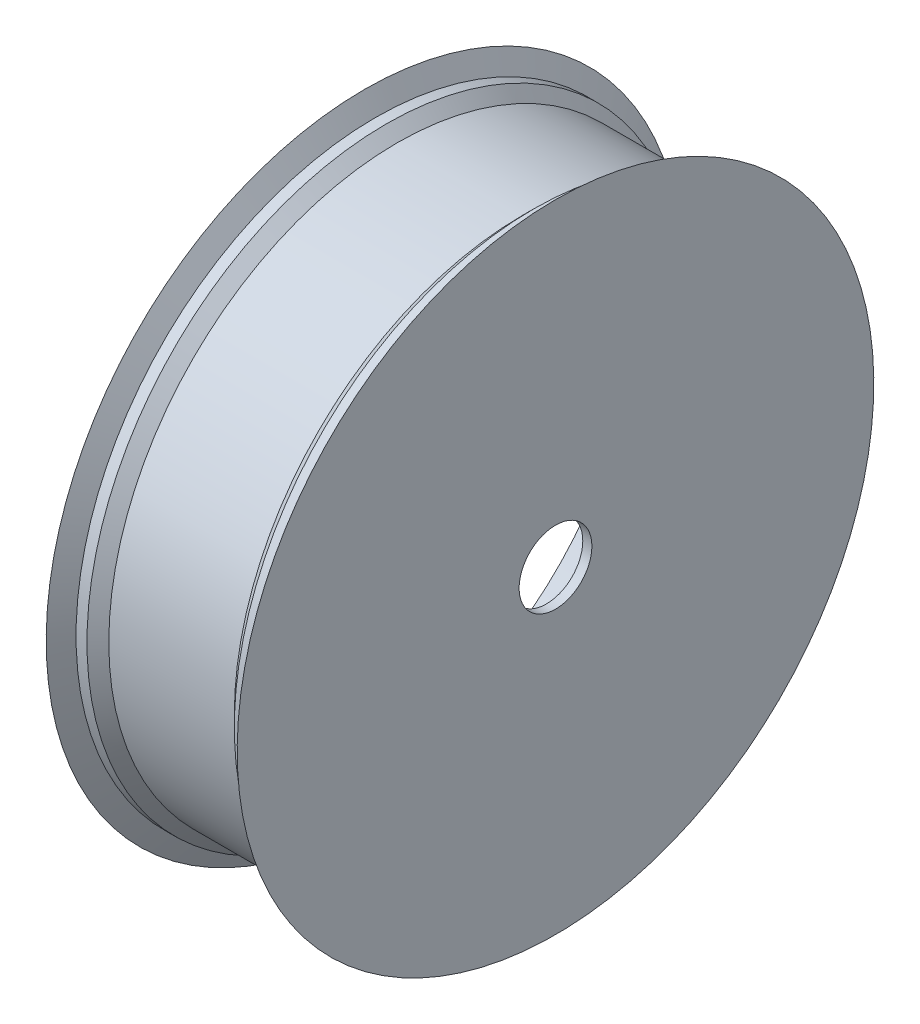
ISO-10303-21;
HEADER;
FILE_DESCRIPTION(('STEP AP214'),'2;1');
FILE_NAME('part.step','',(''),(''),'','','');
FILE_SCHEMA(('AUTOMOTIVE_DESIGN { 1 0 10303 214 1 1 1 1 }'));
ENDSEC;
DATA;
#1=APPLICATION_CONTEXT('core data for automotive mechanical design processes');
#2=APPLICATION_PROTOCOL_DEFINITION('international standard','automotive_design',2000,#1);
#3=PRODUCT_CONTEXT('',#1,'mechanical');
#4=PRODUCT('Part','Part','',(#3));
#5=PRODUCT_RELATED_PRODUCT_CATEGORY('part','',(#4));
#6=PRODUCT_DEFINITION_FORMATION('','',#4);
#7=PRODUCT_DEFINITION_CONTEXT('part definition',#1,'design');
#8=PRODUCT_DEFINITION('design','',#6,#7);
#9=PRODUCT_DEFINITION_SHAPE('','',#8);
#10=(LENGTH_UNIT() NAMED_UNIT(*) SI_UNIT(.MILLI.,.METRE.));
#11=(NAMED_UNIT(*) PLANE_ANGLE_UNIT() SI_UNIT($,.RADIAN.));
#12=(NAMED_UNIT(*) SI_UNIT($,.STERADIAN.) SOLID_ANGLE_UNIT());
#13=UNCERTAINTY_MEASURE_WITH_UNIT(LENGTH_MEASURE(1.E-05),#10,'distance_accuracy_value','');
#14=(GEOMETRIC_REPRESENTATION_CONTEXT(3) GLOBAL_UNCERTAINTY_ASSIGNED_CONTEXT((#13)) GLOBAL_UNIT_ASSIGNED_CONTEXT((#10,
#11,#12)) REPRESENTATION_CONTEXT('',''));
#15=CARTESIAN_POINT('',(0.,0.,0.));
#16=DIRECTION('',(0.,0.,1.));
#17=DIRECTION('',(1.,0.,0.));
#18=AXIS2_PLACEMENT_3D('',#15,#16,#17);
#19=CARTESIAN_POINT('',(0.,0.,0.));
#20=DIRECTION('',(-1.,0.,0.));
#21=DIRECTION('',(0.,-1.,0.));
#22=AXIS2_PLACEMENT_3D('',#19,#20,#21);
#23=PLANE('',#22);
#24=CARTESIAN_POINT('',(0.,0.,0.));
#25=DIRECTION('',(-1.,0.,0.));
#26=DIRECTION('',(0.,-1.,0.));
#27=AXIS2_PLACEMENT_3D('',#24,#25,#26);
#28=CIRCLE('',#27,300.);
#29=CARTESIAN_POINT('',(0.,-300.,0.));
#30=VERTEX_POINT('',#29);
#31=EDGE_CURVE('E79',#30,#30,#28,.T.);
#32=ORIENTED_EDGE('',*,*,#31,.F.);
#33=EDGE_LOOP('',(#32));
#34=FACE_BOUND('',#33,.T.);
#35=CARTESIAN_POINT('',(0.,0.,0.));
#36=DIRECTION('',(1.,0.,0.));
#37=DIRECTION('',(0.,1.,0.));
#38=AXIS2_PLACEMENT_3D('',#35,#36,#37);
#39=CIRCLE('',#38,350.);
#40=CARTESIAN_POINT('',(0.,350.,0.));
#41=VERTEX_POINT('',#40);
#42=EDGE_CURVE('E10',#41,#41,#39,.T.);
#43=ORIENTED_EDGE('',*,*,#42,.F.);
#44=EDGE_LOOP('',(#43));
#45=FACE_BOUND('',#44,.T.);
#46=ADVANCED_FACE('F39',(#34,#45),#23,.T.);
#47=CARTESIAN_POINT('',(12.,0.,0.));
#48=DIRECTION('',(-1.,0.,0.));
#49=DIRECTION('',(0.,-1.,0.));
#50=AXIS2_PLACEMENT_3D('',#47,#48,#49);
#51=CONICAL_SURFACE('',#50,329.169330117653,1.04815554598731);
#52=ORIENTED_EDGE('',*,*,#42,.T.);
#53=EDGE_LOOP('',(#52));
#54=FACE_BOUND('',#53,.T.);
#55=CARTESIAN_POINT('',(12.,0.,0.));
#56=DIRECTION('',(1.,0.,0.));
#57=DIRECTION('',(0.,1.,0.));
#58=AXIS2_PLACEMENT_3D('',#55,#56,#57);
#59=CIRCLE('',#58,329.169330117653);
#60=CARTESIAN_POINT('',(12.,329.169330117653,0.));
#61=VERTEX_POINT('',#60);
#62=EDGE_CURVE('E47',#61,#61,#59,.T.);
#63=ORIENTED_EDGE('',*,*,#62,.F.);
#64=EDGE_LOOP('',(#63));
#65=FACE_BOUND('',#64,.T.);
#66=ADVANCED_FACE('F112',(#54,#65),#51,.T.);
#67=CARTESIAN_POINT('',(210.,0.,0.));
#68=DIRECTION('',(1.,0.,0.));
#69=DIRECTION('',(0.,1.,0.));
#70=AXIS2_PLACEMENT_3D('',#67,#68,#69);
#71=CYLINDRICAL_SURFACE('',#70,329.169330117653);
#72=ORIENTED_EDGE('',*,*,#62,.T.);
#73=EDGE_LOOP('',(#72));
#74=FACE_BOUND('',#73,.T.);
#75=CARTESIAN_POINT('',(24.,0.,0.));
#76=DIRECTION('',(1.,0.,0.));
#77=DIRECTION('',(0.,1.,0.));
#78=AXIS2_PLACEMENT_3D('',#75,#76,#77);
#79=CIRCLE('',#78,329.169330117653);
#80=CARTESIAN_POINT('',(24.,329.169330117653,0.));
#81=VERTEX_POINT('',#80);
#82=EDGE_CURVE('E52',#81,#81,#79,.T.);
#83=ORIENTED_EDGE('',*,*,#82,.F.);
#84=EDGE_LOOP('',(#83));
#85=FACE_BOUND('',#84,.T.);
#86=ADVANCED_FACE('F116',(#74,#85),#71,.T.);
#87=CARTESIAN_POINT('',(36.0000000000001,0.,0.));
#88=DIRECTION('',(-1.,0.,0.));
#89=DIRECTION('',(0.,-1.,0.));
#90=AXIS2_PLACEMENT_3D('',#87,#88,#89);
#91=CONICAL_SURFACE('',#90,317.169330117653,0.785398163397458);
#92=ORIENTED_EDGE('',*,*,#82,.T.);
#93=EDGE_LOOP('',(#92));
#94=FACE_BOUND('',#93,.T.);
#95=CARTESIAN_POINT('',(36.0000000000001,0.,0.));
#96=DIRECTION('',(1.,0.,0.));
#97=DIRECTION('',(0.,1.,0.));
#98=AXIS2_PLACEMENT_3D('',#95,#96,#97);
#99=CIRCLE('',#98,317.169330117653);
#100=CARTESIAN_POINT('',(36.,317.169330117653,0.));
#101=VERTEX_POINT('',#100);
#102=EDGE_CURVE('E58',#101,#101,#99,.T.);
#103=ORIENTED_EDGE('',*,*,#102,.F.);
#104=EDGE_LOOP('',(#103));
#105=FACE_BOUND('',#104,.T.);
#106=ADVANCED_FACE('F120',(#94,#105),#91,.T.);
#107=CARTESIAN_POINT('',(210.,0.,0.));
#108=DIRECTION('',(1.,0.,0.));
#109=DIRECTION('',(0.,1.,0.));
#110=AXIS2_PLACEMENT_3D('',#107,#108,#109);
#111=CYLINDRICAL_SURFACE('',#110,317.169330117653);
#112=ORIENTED_EDGE('',*,*,#102,.T.);
#113=EDGE_LOOP('',(#112));
#114=FACE_BOUND('',#113,.T.);
#115=CARTESIAN_POINT('',(174.,0.,0.));
#116=DIRECTION('',(1.,0.,0.));
#117=DIRECTION('',(0.,1.,0.));
#118=AXIS2_PLACEMENT_3D('',#115,#116,#117);
#119=CIRCLE('',#118,317.169330117653);
#120=CARTESIAN_POINT('',(174.,317.169330117653,0.));
#121=VERTEX_POINT('',#120);
#122=EDGE_CURVE('E62',#121,#121,#119,.T.);
#123=ORIENTED_EDGE('',*,*,#122,.F.);
#124=EDGE_LOOP('',(#123));
#125=FACE_BOUND('',#124,.T.);
#126=ADVANCED_FACE('F127',(#114,#125),#111,.T.);
#127=CARTESIAN_POINT('',(186.,0.,0.));
#128=DIRECTION('',(1.,0.,0.));
#129=DIRECTION('',(0.,1.,0.));
#130=AXIS2_PLACEMENT_3D('',#127,#128,#129);
#131=CONICAL_SURFACE('',#130,329.169330117653,0.785398163397458);
#132=ORIENTED_EDGE('',*,*,#122,.T.);
#133=EDGE_LOOP('',(#132));
#134=FACE_BOUND('',#133,.T.);
#135=CARTESIAN_POINT('',(186.,0.,0.));
#136=DIRECTION('',(1.,0.,0.));
#137=DIRECTION('',(0.,1.,0.));
#138=AXIS2_PLACEMENT_3D('',#135,#136,#137);
#139=CIRCLE('',#138,329.169330117653);
#140=CARTESIAN_POINT('',(186.,329.169330117653,0.));
#141=VERTEX_POINT('',#140);
#142=EDGE_CURVE('E66',#141,#141,#139,.T.);
#143=ORIENTED_EDGE('',*,*,#142,.F.);
#144=EDGE_LOOP('',(#143));
#145=FACE_BOUND('',#144,.T.);
#146=ADVANCED_FACE('F131',(#134,#145),#131,.T.);
#147=CARTESIAN_POINT('',(210.,0.,0.));
#148=DIRECTION('',(1.,0.,0.));
#149=DIRECTION('',(0.,1.,0.));
#150=AXIS2_PLACEMENT_3D('',#147,#148,#149);
#151=CYLINDRICAL_SURFACE('',#150,329.169330117653);
#152=ORIENTED_EDGE('',*,*,#142,.T.);
#153=EDGE_LOOP('',(#152));
#154=FACE_BOUND('',#153,.T.);
#155=CARTESIAN_POINT('',(198.,0.,0.));
#156=DIRECTION('',(1.,0.,0.));
#157=DIRECTION('',(0.,1.,0.));
#158=AXIS2_PLACEMENT_3D('',#155,#156,#157);
#159=CIRCLE('',#158,329.169330117653);
#160=CARTESIAN_POINT('',(198.,329.169330117653,0.));
#161=VERTEX_POINT('',#160);
#162=EDGE_CURVE('E70',#161,#161,#159,.T.);
#163=ORIENTED_EDGE('',*,*,#162,.F.);
#164=EDGE_LOOP('',(#163));
#165=FACE_BOUND('',#164,.T.);
#166=ADVANCED_FACE('F135',(#154,#165),#151,.T.);
#167=CARTESIAN_POINT('',(210.,0.,0.));
#168=DIRECTION('',(1.,0.,0.));
#169=DIRECTION('',(0.,1.,0.));
#170=AXIS2_PLACEMENT_3D('',#167,#168,#169);
#171=CONICAL_SURFACE('',#170,350.,1.04815554598731);
#172=ORIENTED_EDGE('',*,*,#162,.T.);
#173=EDGE_LOOP('',(#172));
#174=FACE_BOUND('',#173,.T.);
#175=CARTESIAN_POINT('',(210.,0.,0.));
#176=DIRECTION('',(1.,0.,0.));
#177=DIRECTION('',(0.,1.,0.));
#178=AXIS2_PLACEMENT_3D('',#175,#176,#177);
#179=CIRCLE('',#178,350.);
#180=CARTESIAN_POINT('',(210.,350.,0.));
#181=VERTEX_POINT('',#180);
#182=EDGE_CURVE('E74',#181,#181,#179,.T.);
#183=ORIENTED_EDGE('',*,*,#182,.F.);
#184=EDGE_LOOP('',(#183));
#185=FACE_BOUND('',#184,.T.);
#186=ADVANCED_FACE('F139',(#174,#185),#171,.T.);
#187=CARTESIAN_POINT('',(210.,350.,0.));
#188=DIRECTION('',(1.,0.,0.));
#189=DIRECTION('',(0.,1.,0.));
#190=AXIS2_PLACEMENT_3D('',#187,#188,#189);
#191=PLANE('',#190);
#192=CARTESIAN_POINT('',(210.,0.,0.));
#193=DIRECTION('',(1.,0.,0.));
#194=DIRECTION('',(0.,1.,0.));
#195=AXIS2_PLACEMENT_3D('',#192,#193,#194);
#196=CIRCLE('',#195,40.);
#197=CARTESIAN_POINT('',(210.,40.,0.));
#198=VERTEX_POINT('',#197);
#199=EDGE_CURVE('E86',#198,#198,#196,.T.);
#200=ORIENTED_EDGE('',*,*,#199,.F.);
#201=EDGE_LOOP('',(#200));
#202=FACE_BOUND('',#201,.T.);
#203=ORIENTED_EDGE('',*,*,#182,.T.);
#204=EDGE_LOOP('',(#203));
#205=FACE_BOUND('',#204,.T.);
#206=ADVANCED_FACE('F106',(#202,#205),#191,.T.);
#207=CARTESIAN_POINT('',(200.,0.,0.));
#208=DIRECTION('',(-1.,0.,0.));
#209=DIRECTION('',(0.,-1.,0.));
#210=AXIS2_PLACEMENT_3D('',#207,#208,#209);
#211=CYLINDRICAL_SURFACE('',#210,300.);
#212=CARTESIAN_POINT('',(200.,0.,0.));
#213=DIRECTION('',(-1.,0.,0.));
#214=DIRECTION('',(0.,-1.,0.));
#215=AXIS2_PLACEMENT_3D('',#212,#213,#214);
#216=CIRCLE('',#215,300.);
#217=CARTESIAN_POINT('',(200.,-300.,0.));
#218=VERTEX_POINT('',#217);
#219=EDGE_CURVE('E78',#218,#218,#216,.T.);
#220=ORIENTED_EDGE('',*,*,#219,.F.);
#221=EDGE_LOOP('',(#220));
#222=FACE_BOUND('',#221,.T.);
#223=ORIENTED_EDGE('',*,*,#31,.T.);
#224=EDGE_LOOP('',(#223));
#225=FACE_BOUND('',#224,.T.);
#226=ADVANCED_FACE('F100',(#222,#225),#211,.F.);
#227=CARTESIAN_POINT('',(200.,0.,0.));
#228=DIRECTION('',(-1.,0.,0.));
#229=DIRECTION('',(0.,-1.,0.));
#230=AXIS2_PLACEMENT_3D('',#227,#228,#229);
#231=PLANE('',#230);
#232=CARTESIAN_POINT('',(200.,0.,0.));
#233=DIRECTION('',(-1.,0.,0.));
#234=DIRECTION('',(0.,-1.,0.));
#235=AXIS2_PLACEMENT_3D('',#232,#233,#234);
#236=CIRCLE('',#235,40.);
#237=CARTESIAN_POINT('',(200.,-40.,0.));
#238=VERTEX_POINT('',#237);
#239=EDGE_CURVE('E42',#238,#238,#236,.T.);
#240=ORIENTED_EDGE('',*,*,#239,.F.);
#241=EDGE_LOOP('',(#240));
#242=FACE_BOUND('',#241,.T.);
#243=ORIENTED_EDGE('',*,*,#219,.T.);
#244=EDGE_LOOP('',(#243));
#245=FACE_BOUND('',#244,.T.);
#246=ADVANCED_FACE('F97',(#242,#245),#231,.T.);
#247=CARTESIAN_POINT('',(9.99999999999993,0.,0.));
#248=DIRECTION('',(1.,0.,0.));
#249=DIRECTION('',(0.,1.,0.));
#250=AXIS2_PLACEMENT_3D('',#247,#248,#249);
#251=CYLINDRICAL_SURFACE('',#250,40.);
#252=ORIENTED_EDGE('',*,*,#239,.T.);
#253=EDGE_LOOP('',(#252));
#254=FACE_BOUND('',#253,.T.);
#255=ORIENTED_EDGE('',*,*,#199,.T.);
#256=EDGE_LOOP('',(#255));
#257=FACE_BOUND('',#256,.T.);
#258=ADVANCED_FACE('F95',(#254,#257),#251,.F.);
#259=CLOSED_SHELL('',(#46,#66,#86,#106,#126,#146,#166,#186,#206,#226,#246,#258));
#260=MANIFOLD_SOLID_BREP('B2',#259);
#261=ADVANCED_BREP_SHAPE_REPRESENTATION('',(#18,#260),#14);
#262=SHAPE_DEFINITION_REPRESENTATION(#9,#261);
ENDSEC;
END-ISO-10303-21;
